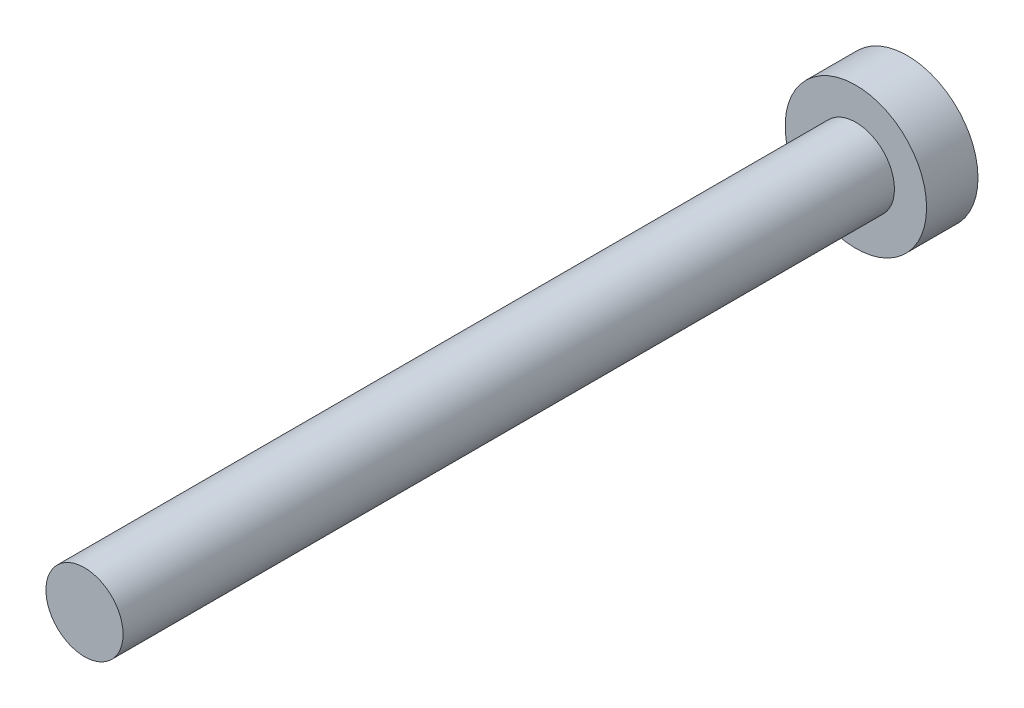
ISO-10303-21;
HEADER;
FILE_DESCRIPTION(('STEP AP214'),'2;1');
FILE_NAME('part.step','',(''),(''),'','','');
FILE_SCHEMA(('AUTOMOTIVE_DESIGN { 1 0 10303 214 1 1 1 1 }'));
ENDSEC;
DATA;
#1=APPLICATION_CONTEXT('core data for automotive mechanical design processes');
#2=APPLICATION_PROTOCOL_DEFINITION('international standard','automotive_design',2000,#1);
#3=PRODUCT_CONTEXT('',#1,'mechanical');
#4=PRODUCT('Part','Part','',(#3));
#5=PRODUCT_RELATED_PRODUCT_CATEGORY('part','',(#4));
#6=PRODUCT_DEFINITION_FORMATION('','',#4);
#7=PRODUCT_DEFINITION_CONTEXT('part definition',#1,'design');
#8=PRODUCT_DEFINITION('design','',#6,#7);
#9=PRODUCT_DEFINITION_SHAPE('','',#8);
#10=(LENGTH_UNIT() NAMED_UNIT(*) SI_UNIT(.MILLI.,.METRE.));
#11=(NAMED_UNIT(*) PLANE_ANGLE_UNIT() SI_UNIT($,.RADIAN.));
#12=(NAMED_UNIT(*) SI_UNIT($,.STERADIAN.) SOLID_ANGLE_UNIT());
#13=UNCERTAINTY_MEASURE_WITH_UNIT(LENGTH_MEASURE(1.E-05),#10,'distance_accuracy_value','');
#14=(GEOMETRIC_REPRESENTATION_CONTEXT(3) GLOBAL_UNCERTAINTY_ASSIGNED_CONTEXT((#13)) GLOBAL_UNIT_ASSIGNED_CONTEXT((#10,
#11,#12)) REPRESENTATION_CONTEXT('',''));
#15=CARTESIAN_POINT('',(0.,0.,0.));
#16=DIRECTION('',(0.,0.,1.));
#17=DIRECTION('',(1.,0.,0.));
#18=AXIS2_PLACEMENT_3D('',#15,#16,#17);
#19=CARTESIAN_POINT('',(0.,0.,2.));
#20=DIRECTION('',(0.,0.,1.));
#21=DIRECTION('',(1.,0.,0.));
#22=AXIS2_PLACEMENT_3D('',#19,#20,#21);
#23=PLANE('',#22);
#24=CARTESIAN_POINT('',(0.,0.,2.));
#25=DIRECTION('',(0.,0.,1.));
#26=DIRECTION('',(1.,0.,0.));
#27=AXIS2_PLACEMENT_3D('',#24,#25,#26);
#28=CIRCLE('',#27,2.75);
#29=CARTESIAN_POINT('',(2.75,0.,2.));
#30=VERTEX_POINT('',#29);
#31=EDGE_CURVE('E10',#30,#30,#28,.T.);
#32=ORIENTED_EDGE('',*,*,#31,.T.);
#33=EDGE_LOOP('',(#32));
#34=FACE_BOUND('',#33,.T.);
#35=CARTESIAN_POINT('',(0.,0.,2.));
#36=DIRECTION('',(0.,0.,1.));
#37=DIRECTION('',(1.,0.,0.));
#38=AXIS2_PLACEMENT_3D('',#35,#36,#37);
#39=CIRCLE('',#38,1.5);
#40=CARTESIAN_POINT('',(1.5,0.,2.));
#41=VERTEX_POINT('',#40);
#42=EDGE_CURVE('E44',#41,#41,#39,.T.);
#43=ORIENTED_EDGE('',*,*,#42,.F.);
#44=EDGE_LOOP('',(#43));
#45=FACE_BOUND('',#44,.T.);
#46=ADVANCED_FACE('F31',(#34,#45),#23,.T.);
#47=CARTESIAN_POINT('',(0.,0.,2.));
#48=DIRECTION('',(0.,0.,-1.));
#49=DIRECTION('',(-1.,0.,0.));
#50=AXIS2_PLACEMENT_3D('',#47,#48,#49);
#51=CYLINDRICAL_SURFACE('',#50,2.75);
#52=ORIENTED_EDGE('',*,*,#31,.F.);
#53=EDGE_LOOP('',(#52));
#54=FACE_BOUND('',#53,.T.);
#55=CARTESIAN_POINT('',(0.,0.,0.));
#56=DIRECTION('',(0.,0.,1.));
#57=DIRECTION('',(1.,0.,0.));
#58=AXIS2_PLACEMENT_3D('',#55,#56,#57);
#59=CIRCLE('',#58,2.75);
#60=CARTESIAN_POINT('',(2.75,0.,0.));
#61=VERTEX_POINT('',#60);
#62=EDGE_CURVE('E35',#61,#61,#59,.T.);
#63=ORIENTED_EDGE('',*,*,#62,.T.);
#64=EDGE_LOOP('',(#63));
#65=FACE_BOUND('',#64,.T.);
#66=ADVANCED_FACE('F33',(#54,#65),#51,.T.);
#67=CARTESIAN_POINT('',(0.,0.,0.));
#68=DIRECTION('',(0.,0.,1.));
#69=DIRECTION('',(1.,0.,0.));
#70=AXIS2_PLACEMENT_3D('',#67,#68,#69);
#71=PLANE('',#70);
#72=ORIENTED_EDGE('',*,*,#62,.F.);
#73=EDGE_LOOP('',(#72));
#74=FACE_BOUND('',#73,.T.);
#75=ADVANCED_FACE('F55',(#74),#71,.F.);
#76=CARTESIAN_POINT('',(0.,0.,32.));
#77=DIRECTION('',(0.,0.,-1.));
#78=DIRECTION('',(-1.,0.,0.));
#79=AXIS2_PLACEMENT_3D('',#76,#77,#78);
#80=CYLINDRICAL_SURFACE('',#79,1.5);
#81=CARTESIAN_POINT('',(0.,0.,32.));
#82=DIRECTION('',(0.,0.,1.));
#83=DIRECTION('',(1.,0.,0.));
#84=AXIS2_PLACEMENT_3D('',#81,#82,#83);
#85=CIRCLE('',#84,1.5);
#86=CARTESIAN_POINT('',(1.5,0.,32.));
#87=VERTEX_POINT('',#86);
#88=EDGE_CURVE('E42',#87,#87,#85,.T.);
#89=ORIENTED_EDGE('',*,*,#88,.F.);
#90=EDGE_LOOP('',(#89));
#91=FACE_BOUND('',#90,.T.);
#92=ORIENTED_EDGE('',*,*,#42,.T.);
#93=EDGE_LOOP('',(#92));
#94=FACE_BOUND('',#93,.T.);
#95=ADVANCED_FACE('F52',(#91,#94),#80,.T.);
#96=CARTESIAN_POINT('',(0.,0.,32.));
#97=DIRECTION('',(0.,0.,1.));
#98=DIRECTION('',(1.,0.,0.));
#99=AXIS2_PLACEMENT_3D('',#96,#97,#98);
#100=PLANE('',#99);
#101=ORIENTED_EDGE('',*,*,#88,.T.);
#102=EDGE_LOOP('',(#101));
#103=FACE_BOUND('',#102,.T.);
#104=ADVANCED_FACE('F50',(#103),#100,.T.);
#105=CLOSED_SHELL('',(#46,#66,#75,#95,#104));
#106=MANIFOLD_SOLID_BREP('B2',#105);
#107=ADVANCED_BREP_SHAPE_REPRESENTATION('',(#18,#106),#14);
#108=SHAPE_DEFINITION_REPRESENTATION(#9,#107);
ENDSEC;
END-ISO-10303-21;
